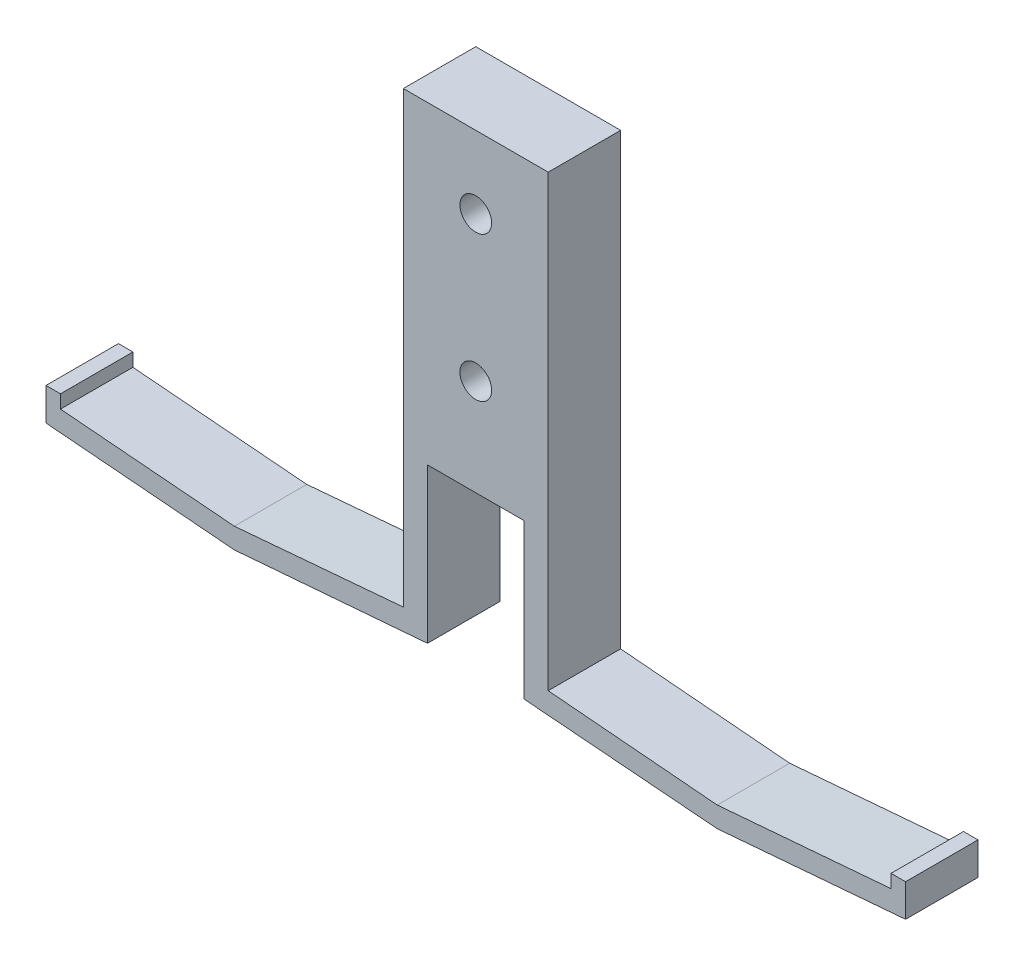
ISO-10303-21;
HEADER;
FILE_DESCRIPTION(('STEP AP214'),'2;1');
FILE_NAME('part.step','',(''),(''),'','','');
FILE_SCHEMA(('AUTOMOTIVE_DESIGN { 1 0 10303 214 1 1 1 1 }'));
ENDSEC;
DATA;
#1=APPLICATION_CONTEXT('core data for automotive mechanical design processes');
#2=APPLICATION_PROTOCOL_DEFINITION('international standard','automotive_design',2000,#1);
#3=PRODUCT_CONTEXT('',#1,'mechanical');
#4=PRODUCT('Part','Part','',(#3));
#5=PRODUCT_RELATED_PRODUCT_CATEGORY('part','',(#4));
#6=PRODUCT_DEFINITION_FORMATION('','',#4);
#7=PRODUCT_DEFINITION_CONTEXT('part definition',#1,'design');
#8=PRODUCT_DEFINITION('design','',#6,#7);
#9=PRODUCT_DEFINITION_SHAPE('','',#8);
#10=(LENGTH_UNIT() NAMED_UNIT(*) SI_UNIT(.MILLI.,.METRE.));
#11=(NAMED_UNIT(*) PLANE_ANGLE_UNIT() SI_UNIT($,.RADIAN.));
#12=(NAMED_UNIT(*) SI_UNIT($,.STERADIAN.) SOLID_ANGLE_UNIT());
#13=UNCERTAINTY_MEASURE_WITH_UNIT(LENGTH_MEASURE(1.E-05),#10,'distance_accuracy_value','');
#14=(GEOMETRIC_REPRESENTATION_CONTEXT(3) GLOBAL_UNCERTAINTY_ASSIGNED_CONTEXT((#13)) GLOBAL_UNIT_ASSIGNED_CONTEXT((#10,
#11,#12)) REPRESENTATION_CONTEXT('',''));
#15=CARTESIAN_POINT('',(0.,0.,0.));
#16=DIRECTION('',(0.,0.,1.));
#17=DIRECTION('',(1.,0.,0.));
#18=AXIS2_PLACEMENT_3D('',#15,#16,#17);
#19=CARTESIAN_POINT('',(-2.88683144246353,-33.6797001620745,19.05));
#20=DIRECTION('',(0.0854011413464357,0.996346649041751,0.));
#21=DIRECTION('',(-0.996346649041751,0.0854011413464357,0.));
#22=AXIS2_PLACEMENT_3D('',#19,#20,#21);
#23=PLANE('',#22);
#24=DIRECTION('',(0.996346649041751,-0.0854011413464357,0.));
#25=VECTOR('',#24,1.);
#26=CARTESIAN_POINT('',(-2.88683144246353,-33.6797001620745,0.));
#27=LINE('',#26,#25);
#28=CARTESIAN_POINT('',(19.05,-35.56,0.));
#29=VERTEX_POINT('',#28);
#30=CARTESIAN_POINT('',(63.5,-39.37,0.));
#31=VERTEX_POINT('',#30);
#32=EDGE_CURVE('E210',#29,#31,#27,.T.);
#33=ORIENTED_EDGE('',*,*,#32,.F.);
#34=DIRECTION('',(0.,0.,-1.));
#35=VECTOR('',#34,1.);
#36=CARTESIAN_POINT('',(19.05,-35.56,19.05));
#37=LINE('',#36,#35);
#38=CARTESIAN_POINT('',(19.05,-35.56,19.05));
#39=VERTEX_POINT('',#38);
#40=EDGE_CURVE('E11',#39,#29,#37,.T.);
#41=ORIENTED_EDGE('',*,*,#40,.F.);
#42=DIRECTION('',(0.996346649041751,-0.0854011413464357,0.));
#43=VECTOR('',#42,1.);
#44=CARTESIAN_POINT('',(-2.88683144246353,-33.6797001620745,19.05));
#45=LINE('',#44,#43);
#46=CARTESIAN_POINT('',(63.5,-39.37,19.05));
#47=VERTEX_POINT('',#46);
#48=EDGE_CURVE('E280',#39,#47,#45,.T.);
#49=ORIENTED_EDGE('',*,*,#48,.T.);
#50=DIRECTION('',(0.,0.,-1.));
#51=VECTOR('',#50,1.);
#52=CARTESIAN_POINT('',(63.5,-39.37,19.05));
#53=LINE('',#52,#51);
#54=EDGE_CURVE('E129',#47,#31,#53,.T.);
#55=ORIENTED_EDGE('',*,*,#54,.T.);
#56=EDGE_LOOP('',(#33,#41,#49,#55));
#57=FACE_BOUND('',#56,.T.);
#58=ADVANCED_FACE('F41',(#57),#23,.T.);
#59=CARTESIAN_POINT('',(19.05,0.,19.05));
#60=DIRECTION('',(1.,0.,0.));
#61=DIRECTION('',(0.,1.,0.));
#62=AXIS2_PLACEMENT_3D('',#59,#60,#61);
#63=PLANE('',#62);
#64=DIRECTION('',(0.,-1.,0.));
#65=VECTOR('',#64,1.);
#66=CARTESIAN_POINT('',(19.05,0.,0.));
#67=LINE('',#66,#65);
#68=CARTESIAN_POINT('',(19.05,82.55,0.));
#69=VERTEX_POINT('',#68);
#70=EDGE_CURVE('E214',#69,#29,#67,.T.);
#71=ORIENTED_EDGE('',*,*,#70,.F.);
#72=DIRECTION('',(0.,0.,-1.));
#73=VECTOR('',#72,1.);
#74=CARTESIAN_POINT('',(19.05,82.55,19.05));
#75=LINE('',#74,#73);
#76=CARTESIAN_POINT('',(19.05,82.55,19.05));
#77=VERTEX_POINT('',#76);
#78=EDGE_CURVE('E50',#77,#69,#75,.T.);
#79=ORIENTED_EDGE('',*,*,#78,.F.);
#80=DIRECTION('',(0.,-1.,0.));
#81=VECTOR('',#80,1.);
#82=CARTESIAN_POINT('',(19.05,0.,19.05));
#83=LINE('',#82,#81);
#84=EDGE_CURVE('E349',#77,#39,#83,.T.);
#85=ORIENTED_EDGE('',*,*,#84,.T.);
#86=ORIENTED_EDGE('',*,*,#40,.T.);
#87=EDGE_LOOP('',(#71,#79,#85,#86));
#88=FACE_BOUND('',#87,.T.);
#89=ADVANCED_FACE('F348',(#88),#63,.T.);
#90=CARTESIAN_POINT('',(0.,82.55,19.05));
#91=DIRECTION('',(0.,-1.,0.));
#92=DIRECTION('',(0.,0.,-1.));
#93=AXIS2_PLACEMENT_3D('',#90,#91,#92);
#94=PLANE('',#93);
#95=DIRECTION('',(-1.,0.,0.));
#96=VECTOR('',#95,1.);
#97=CARTESIAN_POINT('',(0.,82.55,0.));
#98=LINE('',#97,#96);
#99=CARTESIAN_POINT('',(-19.05,82.55,0.));
#100=VERTEX_POINT('',#99);
#101=EDGE_CURVE('E219',#69,#100,#98,.T.);
#102=ORIENTED_EDGE('',*,*,#101,.T.);
#103=DIRECTION('',(0.,0.,-1.));
#104=VECTOR('',#103,1.);
#105=CARTESIAN_POINT('',(-19.05,82.55,19.05));
#106=LINE('',#105,#104);
#107=CARTESIAN_POINT('',(-19.05,82.55,19.05));
#108=VERTEX_POINT('',#107);
#109=EDGE_CURVE('E330',#108,#100,#106,.T.);
#110=ORIENTED_EDGE('',*,*,#109,.F.);
#111=DIRECTION('',(-1.,0.,0.));
#112=VECTOR('',#111,1.);
#113=CARTESIAN_POINT('',(0.,82.55,19.05));
#114=LINE('',#113,#112);
#115=EDGE_CURVE('E339',#77,#108,#114,.T.);
#116=ORIENTED_EDGE('',*,*,#115,.F.);
#117=ORIENTED_EDGE('',*,*,#78,.T.);
#118=EDGE_LOOP('',(#102,#110,#116,#117));
#119=FACE_BOUND('',#118,.T.);
#120=ADVANCED_FACE('F337',(#119),#94,.F.);
#121=CARTESIAN_POINT('',(-19.05,0.,19.05));
#122=DIRECTION('',(1.,0.,0.));
#123=DIRECTION('',(0.,1.,0.));
#124=AXIS2_PLACEMENT_3D('',#121,#122,#123);
#125=PLANE('',#124);
#126=DIRECTION('',(0.,-1.,0.));
#127=VECTOR('',#126,1.);
#128=CARTESIAN_POINT('',(-19.05,0.,0.));
#129=LINE('',#128,#127);
#130=CARTESIAN_POINT('',(-19.05,-35.56,0.));
#131=VERTEX_POINT('',#130);
#132=EDGE_CURVE('E222',#100,#131,#129,.T.);
#133=ORIENTED_EDGE('',*,*,#132,.T.);
#134=DIRECTION('',(0.,0.,-1.));
#135=VECTOR('',#134,1.);
#136=CARTESIAN_POINT('',(-19.05,-35.56,19.05));
#137=LINE('',#136,#135);
#138=CARTESIAN_POINT('',(-19.05,-35.56,19.05));
#139=VERTEX_POINT('',#138);
#140=EDGE_CURVE('E326',#139,#131,#137,.T.);
#141=ORIENTED_EDGE('',*,*,#140,.F.);
#142=DIRECTION('',(0.,-1.,0.));
#143=VECTOR('',#142,1.);
#144=CARTESIAN_POINT('',(-19.05,0.,19.05));
#145=LINE('',#144,#143);
#146=EDGE_CURVE('E362',#108,#139,#145,.T.);
#147=ORIENTED_EDGE('',*,*,#146,.F.);
#148=ORIENTED_EDGE('',*,*,#109,.T.);
#149=EDGE_LOOP('',(#133,#141,#147,#148));
#150=FACE_BOUND('',#149,.T.);
#151=ADVANCED_FACE('F466',(#150),#125,.F.);
#152=CARTESIAN_POINT('',(2.88683144246353,-33.6797001620746,19.05));
#153=DIRECTION('',(0.0854011413464358,-0.996346649041751,0.));
#154=DIRECTION('',(0.996346649041751,0.0854011413464358,0.));
#155=AXIS2_PLACEMENT_3D('',#152,#153,#154);
#156=PLANE('',#155);
#157=DIRECTION('',(-0.996346649041751,-0.0854011413464358,0.));
#158=VECTOR('',#157,1.);
#159=CARTESIAN_POINT('',(2.88683144246353,-33.6797001620746,0.));
#160=LINE('',#159,#158);
#161=CARTESIAN_POINT('',(-63.5,-39.37,0.));
#162=VERTEX_POINT('',#161);
#163=EDGE_CURVE('E225',#131,#162,#160,.T.);
#164=ORIENTED_EDGE('',*,*,#163,.T.);
#165=DIRECTION('',(0.,0.,-1.));
#166=VECTOR('',#165,1.);
#167=CARTESIAN_POINT('',(-63.5,-39.37,19.05));
#168=LINE('',#167,#166);
#169=CARTESIAN_POINT('',(-63.5,-39.37,19.05));
#170=VERTEX_POINT('',#169);
#171=EDGE_CURVE('E323',#170,#162,#168,.T.);
#172=ORIENTED_EDGE('',*,*,#171,.F.);
#173=DIRECTION('',(-0.996346649041751,-0.0854011413464358,0.));
#174=VECTOR('',#173,1.);
#175=CARTESIAN_POINT('',(2.88683144246353,-33.6797001620746,19.05));
#176=LINE('',#175,#174);
#177=EDGE_CURVE('E365',#139,#170,#176,.T.);
#178=ORIENTED_EDGE('',*,*,#177,.F.);
#179=ORIENTED_EDGE('',*,*,#140,.T.);
#180=EDGE_LOOP('',(#164,#172,#178,#179));
#181=FACE_BOUND('',#180,.T.);
#182=ADVANCED_FACE('F462',(#181),#156,.F.);
#183=CARTESIAN_POINT('',(-3.69613793103445,-44.3536551724138,19.05));
#184=DIRECTION('',(0.0830454798537394,0.99654575824488,0.));
#185=DIRECTION('',(-0.99654575824488,0.0830454798537394,0.));
#186=AXIS2_PLACEMENT_3D('',#183,#184,#185);
#187=PLANE('',#186);
#188=DIRECTION('',(0.99654575824488,-0.0830454798537394,0.));
#189=VECTOR('',#188,1.);
#190=CARTESIAN_POINT('',(-3.69613793103445,-44.3536551724138,0.));
#191=LINE('',#190,#189);
#192=CARTESIAN_POINT('',(-109.22,-35.56,0.));
#193=VERTEX_POINT('',#192);
#194=EDGE_CURVE('E229',#193,#162,#191,.T.);
#195=ORIENTED_EDGE('',*,*,#194,.F.);
#196=DIRECTION('',(0.,0.,-1.));
#197=VECTOR('',#196,1.);
#198=CARTESIAN_POINT('',(-109.22,-35.56,19.05));
#199=LINE('',#198,#197);
#200=CARTESIAN_POINT('',(-109.22,-35.56,19.05));
#201=VERTEX_POINT('',#200);
#202=EDGE_CURVE('E320',#201,#193,#199,.T.);
#203=ORIENTED_EDGE('',*,*,#202,.F.);
#204=DIRECTION('',(0.99654575824488,-0.0830454798537394,0.));
#205=VECTOR('',#204,1.);
#206=CARTESIAN_POINT('',(-3.69613793103445,-44.3536551724138,19.05));
#207=LINE('',#206,#205);
#208=EDGE_CURVE('E368',#201,#170,#207,.T.);
#209=ORIENTED_EDGE('',*,*,#208,.T.);
#210=ORIENTED_EDGE('',*,*,#171,.T.);
#211=EDGE_LOOP('',(#195,#203,#209,#210));
#212=FACE_BOUND('',#211,.T.);
#213=ADVANCED_FACE('F457',(#212),#187,.T.);
#214=CARTESIAN_POINT('',(-109.22,0.,19.05));
#215=DIRECTION('',(1.,0.,0.));
#216=DIRECTION('',(0.,0.,-1.));
#217=AXIS2_PLACEMENT_3D('',#214,#215,#216);
#218=PLANE('',#217);
#219=DIRECTION('',(0.,-1.,0.));
#220=VECTOR('',#219,1.);
#221=CARTESIAN_POINT('',(-109.22,0.,0.));
#222=LINE('',#221,#220);
#223=CARTESIAN_POINT('',(-109.22,-32.0675,0.));
#224=VERTEX_POINT('',#223);
#225=EDGE_CURVE('E233',#224,#193,#222,.T.);
#226=ORIENTED_EDGE('',*,*,#225,.F.);
#227=DIRECTION('',(0.,0.,-1.));
#228=VECTOR('',#227,1.);
#229=CARTESIAN_POINT('',(-109.22,-32.0675,19.05));
#230=LINE('',#229,#228);
#231=CARTESIAN_POINT('',(-109.22,-32.0675,19.05));
#232=VERTEX_POINT('',#231);
#233=EDGE_CURVE('E317',#232,#224,#230,.T.);
#234=ORIENTED_EDGE('',*,*,#233,.F.);
#235=DIRECTION('',(0.,-1.,0.));
#236=VECTOR('',#235,1.);
#237=CARTESIAN_POINT('',(-109.22,0.,19.05));
#238=LINE('',#237,#236);
#239=EDGE_CURVE('E372',#232,#201,#238,.T.);
#240=ORIENTED_EDGE('',*,*,#239,.T.);
#241=ORIENTED_EDGE('',*,*,#202,.T.);
#242=EDGE_LOOP('',(#226,#234,#240,#241));
#243=FACE_BOUND('',#242,.T.);
#244=ADVANCED_FACE('F454',(#243),#218,.T.);
#245=CARTESIAN_POINT('',(0.,-32.0675,19.05));
#246=DIRECTION('',(0.,1.,0.));
#247=DIRECTION('',(0.,0.,1.));
#248=AXIS2_PLACEMENT_3D('',#245,#246,#247);
#249=PLANE('',#248);
#250=DIRECTION('',(1.,0.,0.));
#251=VECTOR('',#250,1.);
#252=CARTESIAN_POINT('',(0.,-32.0675,0.));
#253=LINE('',#252,#251);
#254=CARTESIAN_POINT('',(-113.03,-32.0675,0.));
#255=VERTEX_POINT('',#254);
#256=EDGE_CURVE('E237',#255,#224,#253,.T.);
#257=ORIENTED_EDGE('',*,*,#256,.F.);
#258=DIRECTION('',(0.,0.,-1.));
#259=VECTOR('',#258,1.);
#260=CARTESIAN_POINT('',(-113.03,-32.0675,19.05));
#261=LINE('',#260,#259);
#262=CARTESIAN_POINT('',(-113.03,-32.0675,19.05));
#263=VERTEX_POINT('',#262);
#264=EDGE_CURVE('E314',#263,#255,#261,.T.);
#265=ORIENTED_EDGE('',*,*,#264,.F.);
#266=DIRECTION('',(1.,0.,0.));
#267=VECTOR('',#266,1.);
#268=CARTESIAN_POINT('',(0.,-32.0675,19.05));
#269=LINE('',#268,#267);
#270=EDGE_CURVE('E376',#263,#232,#269,.T.);
#271=ORIENTED_EDGE('',*,*,#270,.T.);
#272=ORIENTED_EDGE('',*,*,#233,.T.);
#273=EDGE_LOOP('',(#257,#265,#271,#272));
#274=FACE_BOUND('',#273,.T.);
#275=ADVANCED_FACE('F450',(#274),#249,.T.);
#276=CARTESIAN_POINT('',(-113.03,0.,19.05));
#277=DIRECTION('',(-1.,0.,0.));
#278=DIRECTION('',(0.,0.,1.));
#279=AXIS2_PLACEMENT_3D('',#276,#277,#278);
#280=PLANE('',#279);
#281=DIRECTION('',(0.,1.,0.));
#282=VECTOR('',#281,1.);
#283=CARTESIAN_POINT('',(-113.03,0.,0.));
#284=LINE('',#283,#282);
#285=CARTESIAN_POINT('',(-113.03,-40.64,0.));
#286=VERTEX_POINT('',#285);
#287=EDGE_CURVE('E241',#286,#255,#284,.T.);
#288=ORIENTED_EDGE('',*,*,#287,.F.);
#289=DIRECTION('',(0.,0.,-1.));
#290=VECTOR('',#289,1.);
#291=CARTESIAN_POINT('',(-113.03,-40.64,19.05));
#292=LINE('',#291,#290);
#293=CARTESIAN_POINT('',(-113.03,-40.64,19.05));
#294=VERTEX_POINT('',#293);
#295=EDGE_CURVE('E311',#294,#286,#292,.T.);
#296=ORIENTED_EDGE('',*,*,#295,.F.);
#297=DIRECTION('',(0.,1.,0.));
#298=VECTOR('',#297,1.);
#299=CARTESIAN_POINT('',(-113.03,0.,19.05));
#300=LINE('',#299,#298);
#301=EDGE_CURVE('E380',#294,#263,#300,.T.);
#302=ORIENTED_EDGE('',*,*,#301,.T.);
#303=ORIENTED_EDGE('',*,*,#264,.T.);
#304=EDGE_LOOP('',(#288,#296,#302,#303));
#305=FACE_BOUND('',#304,.T.);
#306=ADVANCED_FACE('F446',(#305),#280,.T.);
#307=CARTESIAN_POINT('',(-4.14282758620687,-49.7139310344827,19.05));
#308=DIRECTION('',(-0.0830454798537396,-0.99654575824488,0.));
#309=DIRECTION('',(0.99654575824488,-0.0830454798537396,0.));
#310=AXIS2_PLACEMENT_3D('',#307,#308,#309);
#311=PLANE('',#310);
#312=DIRECTION('',(-0.99654575824488,0.0830454798537396,0.));
#313=VECTOR('',#312,1.);
#314=CARTESIAN_POINT('',(-4.14282758620687,-49.7139310344827,0.));
#315=LINE('',#314,#313);
#316=CARTESIAN_POINT('',(-63.5,-44.7675,0.));
#317=VERTEX_POINT('',#316);
#318=EDGE_CURVE('E245',#317,#286,#315,.T.);
#319=ORIENTED_EDGE('',*,*,#318,.F.);
#320=DIRECTION('',(0.,0.,-1.));
#321=VECTOR('',#320,1.);
#322=CARTESIAN_POINT('',(-63.5,-44.7675,19.05));
#323=LINE('',#322,#321);
#324=CARTESIAN_POINT('',(-63.5,-44.7675,19.05));
#325=VERTEX_POINT('',#324);
#326=EDGE_CURVE('E308',#325,#317,#323,.T.);
#327=ORIENTED_EDGE('',*,*,#326,.F.);
#328=DIRECTION('',(-0.99654575824488,0.0830454798537396,0.));
#329=VECTOR('',#328,1.);
#330=CARTESIAN_POINT('',(-4.14282758620687,-49.7139310344827,19.05));
#331=LINE('',#330,#329);
#332=EDGE_CURVE('E384',#325,#294,#331,.T.);
#333=ORIENTED_EDGE('',*,*,#332,.T.);
#334=ORIENTED_EDGE('',*,*,#295,.T.);
#335=EDGE_LOOP('',(#319,#327,#333,#334));
#336=FACE_BOUND('',#335,.T.);
#337=ADVANCED_FACE('F442',(#336),#311,.T.);
#338=CARTESIAN_POINT('',(3.19705460048895,-39.3483643137103,19.05));
#339=DIRECTION('',(0.0809831321077374,-0.996715472095232,0.));
#340=DIRECTION('',(0.996715472095232,0.0809831321077374,0.));
#341=AXIS2_PLACEMENT_3D('',#338,#339,#340);
#342=PLANE('',#341);
#343=DIRECTION('',(-0.996715472095232,-0.0809831321077374,0.));
#344=VECTOR('',#343,1.);
#345=CARTESIAN_POINT('',(3.19705460048895,-39.3483643137103,0.));
#346=LINE('',#345,#344);
#347=CARTESIAN_POINT('',(-12.7,-40.64,0.));
#348=VERTEX_POINT('',#347);
#349=EDGE_CURVE('E249',#348,#317,#346,.T.);
#350=ORIENTED_EDGE('',*,*,#349,.F.);
#351=DIRECTION('',(0.,0.,-1.));
#352=VECTOR('',#351,1.);
#353=CARTESIAN_POINT('',(-12.7,-40.64,19.05));
#354=LINE('',#353,#352);
#355=CARTESIAN_POINT('',(-12.7,-40.64,19.05));
#356=VERTEX_POINT('',#355);
#357=EDGE_CURVE('E305',#356,#348,#354,.T.);
#358=ORIENTED_EDGE('',*,*,#357,.F.);
#359=DIRECTION('',(-0.996715472095232,-0.0809831321077374,0.));
#360=VECTOR('',#359,1.);
#361=CARTESIAN_POINT('',(3.19705460048895,-39.3483643137103,19.05));
#362=LINE('',#361,#360);
#363=EDGE_CURVE('E388',#356,#325,#362,.T.);
#364=ORIENTED_EDGE('',*,*,#363,.T.);
#365=ORIENTED_EDGE('',*,*,#326,.T.);
#366=EDGE_LOOP('',(#350,#358,#364,#365));
#367=FACE_BOUND('',#366,.T.);
#368=ADVANCED_FACE('F438',(#367),#342,.T.);
#369=CARTESIAN_POINT('',(-12.7,0.,19.05));
#370=DIRECTION('',(1.,0.,0.));
#371=DIRECTION('',(0.,1.,0.));
#372=AXIS2_PLACEMENT_3D('',#369,#370,#371);
#373=PLANE('',#372);
#374=DIRECTION('',(0.,-1.,0.));
#375=VECTOR('',#374,1.);
#376=CARTESIAN_POINT('',(-12.7,0.,0.));
#377=LINE('',#376,#375);
#378=CARTESIAN_POINT('',(-12.7,0.,0.));
#379=VERTEX_POINT('',#378);
#380=EDGE_CURVE('E253',#379,#348,#377,.T.);
#381=ORIENTED_EDGE('',*,*,#380,.F.);
#382=DIRECTION('',(0.,0.,-1.));
#383=VECTOR('',#382,1.);
#384=CARTESIAN_POINT('',(-12.7,0.,19.05));
#385=LINE('',#384,#383);
#386=CARTESIAN_POINT('',(-12.7,0.,19.05));
#387=VERTEX_POINT('',#386);
#388=EDGE_CURVE('E302',#387,#379,#385,.T.);
#389=ORIENTED_EDGE('',*,*,#388,.F.);
#390=DIRECTION('',(0.,-1.,0.));
#391=VECTOR('',#390,1.);
#392=CARTESIAN_POINT('',(-12.7,0.,19.05));
#393=LINE('',#392,#391);
#394=EDGE_CURVE('E392',#387,#356,#393,.T.);
#395=ORIENTED_EDGE('',*,*,#394,.T.);
#396=ORIENTED_EDGE('',*,*,#357,.T.);
#397=EDGE_LOOP('',(#381,#389,#395,#396));
#398=FACE_BOUND('',#397,.T.);
#399=ADVANCED_FACE('F434',(#398),#373,.T.);
#400=CARTESIAN_POINT('',(0.,0.,19.05));
#401=DIRECTION('',(0.,-1.,0.));
#402=DIRECTION('',(0.,0.,-1.));
#403=AXIS2_PLACEMENT_3D('',#400,#401,#402);
#404=PLANE('',#403);
#405=DIRECTION('',(-1.,0.,0.));
#406=VECTOR('',#405,1.);
#407=CARTESIAN_POINT('',(0.,0.,0.));
#408=LINE('',#407,#406);
#409=CARTESIAN_POINT('',(12.7,0.,0.));
#410=VERTEX_POINT('',#409);
#411=EDGE_CURVE('E257',#410,#379,#408,.T.);
#412=ORIENTED_EDGE('',*,*,#411,.F.);
#413=DIRECTION('',(0.,0.,-1.));
#414=VECTOR('',#413,1.);
#415=CARTESIAN_POINT('',(12.7,0.,19.05));
#416=LINE('',#415,#414);
#417=CARTESIAN_POINT('',(12.7,0.,19.05));
#418=VERTEX_POINT('',#417);
#419=EDGE_CURVE('E299',#418,#410,#416,.T.);
#420=ORIENTED_EDGE('',*,*,#419,.F.);
#421=DIRECTION('',(-1.,0.,0.));
#422=VECTOR('',#421,1.);
#423=CARTESIAN_POINT('',(0.,0.,19.05));
#424=LINE('',#423,#422);
#425=EDGE_CURVE('E396',#418,#387,#424,.T.);
#426=ORIENTED_EDGE('',*,*,#425,.T.);
#427=ORIENTED_EDGE('',*,*,#388,.T.);
#428=EDGE_LOOP('',(#412,#420,#426,#427));
#429=FACE_BOUND('',#428,.T.);
#430=ADVANCED_FACE('F430',(#429),#404,.T.);
#431=CARTESIAN_POINT('',(12.7,0.,19.05));
#432=DIRECTION('',(1.,0.,0.));
#433=DIRECTION('',(0.,1.,0.));
#434=AXIS2_PLACEMENT_3D('',#431,#432,#433);
#435=PLANE('',#434);
#436=DIRECTION('',(0.,-1.,0.));
#437=VECTOR('',#436,1.);
#438=CARTESIAN_POINT('',(12.7,0.,0.));
#439=LINE('',#438,#437);
#440=CARTESIAN_POINT('',(12.7,-40.64,0.));
#441=VERTEX_POINT('',#440);
#442=EDGE_CURVE('E261',#410,#441,#439,.T.);
#443=ORIENTED_EDGE('',*,*,#442,.T.);
#444=DIRECTION('',(0.,0.,-1.));
#445=VECTOR('',#444,1.);
#446=CARTESIAN_POINT('',(12.7,-40.64,19.05));
#447=LINE('',#446,#445);
#448=CARTESIAN_POINT('',(12.7,-40.64,19.05));
#449=VERTEX_POINT('',#448);
#450=EDGE_CURVE('E295',#449,#441,#447,.T.);
#451=ORIENTED_EDGE('',*,*,#450,.F.);
#452=DIRECTION('',(0.,-1.,0.));
#453=VECTOR('',#452,1.);
#454=CARTESIAN_POINT('',(12.7,0.,19.05));
#455=LINE('',#454,#453);
#456=EDGE_CURVE('E400',#418,#449,#455,.T.);
#457=ORIENTED_EDGE('',*,*,#456,.F.);
#458=ORIENTED_EDGE('',*,*,#419,.T.);
#459=EDGE_LOOP('',(#443,#451,#457,#458));
#460=FACE_BOUND('',#459,.T.);
#461=ADVANCED_FACE('F427',(#460),#435,.F.);
#462=CARTESIAN_POINT('',(-3.19705460048894,-39.3483643137103,19.05));
#463=DIRECTION('',(0.0809831321077371,0.996715472095232,0.));
#464=DIRECTION('',(-0.996715472095232,0.0809831321077371,0.));
#465=AXIS2_PLACEMENT_3D('',#462,#463,#464);
#466=PLANE('',#465);
#467=DIRECTION('',(0.996715472095232,-0.0809831321077372,0.));
#468=VECTOR('',#467,1.);
#469=CARTESIAN_POINT('',(-3.19705460048894,-39.3483643137103,0.));
#470=LINE('',#469,#468);
#471=CARTESIAN_POINT('',(63.5,-44.7675,0.));
#472=VERTEX_POINT('',#471);
#473=EDGE_CURVE('E264',#441,#472,#470,.T.);
#474=ORIENTED_EDGE('',*,*,#473,.T.);
#475=DIRECTION('',(0.,0.,-1.));
#476=VECTOR('',#475,1.);
#477=CARTESIAN_POINT('',(63.5,-44.7675,19.05));
#478=LINE('',#477,#476);
#479=CARTESIAN_POINT('',(63.5,-44.7675,19.05));
#480=VERTEX_POINT('',#479);
#481=EDGE_CURVE('E291',#480,#472,#478,.T.);
#482=ORIENTED_EDGE('',*,*,#481,.F.);
#483=DIRECTION('',(0.996715472095232,-0.0809831321077372,0.));
#484=VECTOR('',#483,1.);
#485=CARTESIAN_POINT('',(-3.19705460048894,-39.3483643137103,19.05));
#486=LINE('',#485,#484);
#487=EDGE_CURVE('E403',#449,#480,#486,.T.);
#488=ORIENTED_EDGE('',*,*,#487,.F.);
#489=ORIENTED_EDGE('',*,*,#450,.T.);
#490=EDGE_LOOP('',(#474,#482,#488,#489));
#491=FACE_BOUND('',#490,.T.);
#492=ADVANCED_FACE('F423',(#491),#466,.F.);
#493=CARTESIAN_POINT('',(4.14282758620689,-49.7139310344827,19.05));
#494=DIRECTION('',(-0.0830454798537398,0.99654575824488,0.));
#495=DIRECTION('',(-0.99654575824488,-0.0830454798537398,0.));
#496=AXIS2_PLACEMENT_3D('',#493,#494,#495);
#497=PLANE('',#496);
#498=DIRECTION('',(0.99654575824488,0.0830454798537398,0.));
#499=VECTOR('',#498,1.);
#500=CARTESIAN_POINT('',(4.14282758620689,-49.7139310344827,0.));
#501=LINE('',#500,#499);
#502=CARTESIAN_POINT('',(113.03,-40.64,0.));
#503=VERTEX_POINT('',#502);
#504=EDGE_CURVE('E267',#472,#503,#501,.T.);
#505=ORIENTED_EDGE('',*,*,#504,.T.);
#506=DIRECTION('',(0.,0.,-1.));
#507=VECTOR('',#506,1.);
#508=CARTESIAN_POINT('',(113.03,-40.64,19.05));
#509=LINE('',#508,#507);
#510=CARTESIAN_POINT('',(113.03,-40.64,19.05));
#511=VERTEX_POINT('',#510);
#512=EDGE_CURVE('E287',#511,#503,#509,.T.);
#513=ORIENTED_EDGE('',*,*,#512,.F.);
#514=DIRECTION('',(0.99654575824488,0.0830454798537398,0.));
#515=VECTOR('',#514,1.);
#516=CARTESIAN_POINT('',(4.14282758620689,-49.7139310344827,19.05));
#517=LINE('',#516,#515);
#518=EDGE_CURVE('E406',#480,#511,#517,.T.);
#519=ORIENTED_EDGE('',*,*,#518,.F.);
#520=ORIENTED_EDGE('',*,*,#481,.T.);
#521=EDGE_LOOP('',(#505,#513,#519,#520));
#522=FACE_BOUND('',#521,.T.);
#523=ADVANCED_FACE('F414',(#522),#497,.F.);
#524=CARTESIAN_POINT('',(113.03,0.,19.05));
#525=DIRECTION('',(-1.,0.,0.));
#526=DIRECTION('',(0.,0.,1.));
#527=AXIS2_PLACEMENT_3D('',#524,#525,#526);
#528=PLANE('',#527);
#529=DIRECTION('',(0.,1.,0.));
#530=VECTOR('',#529,1.);
#531=CARTESIAN_POINT('',(113.03,0.,0.));
#532=LINE('',#531,#530);
#533=CARTESIAN_POINT('',(113.03,-32.0675,0.));
#534=VERTEX_POINT('',#533);
#535=EDGE_CURVE('E270',#503,#534,#532,.T.);
#536=ORIENTED_EDGE('',*,*,#535,.T.);
#537=DIRECTION('',(0.,0.,-1.));
#538=VECTOR('',#537,1.);
#539=CARTESIAN_POINT('',(113.03,-32.0675,19.05));
#540=LINE('',#539,#538);
#541=CARTESIAN_POINT('',(113.03,-32.0675,19.05));
#542=VERTEX_POINT('',#541);
#543=EDGE_CURVE('E200',#542,#534,#540,.T.);
#544=ORIENTED_EDGE('',*,*,#543,.F.);
#545=DIRECTION('',(0.,1.,0.));
#546=VECTOR('',#545,1.);
#547=CARTESIAN_POINT('',(113.03,0.,19.05));
#548=LINE('',#547,#546);
#549=EDGE_CURVE('E189',#511,#542,#548,.T.);
#550=ORIENTED_EDGE('',*,*,#549,.F.);
#551=ORIENTED_EDGE('',*,*,#512,.T.);
#552=EDGE_LOOP('',(#536,#544,#550,#551));
#553=FACE_BOUND('',#552,.T.);
#554=ADVANCED_FACE('F418',(#553),#528,.F.);
#555=CARTESIAN_POINT('',(0.,-32.0675,19.05));
#556=DIRECTION('',(0.,-1.,0.));
#557=DIRECTION('',(0.,0.,-1.));
#558=AXIS2_PLACEMENT_3D('',#555,#556,#557);
#559=PLANE('',#558);
#560=DIRECTION('',(-1.,0.,0.));
#561=VECTOR('',#560,1.);
#562=CARTESIAN_POINT('',(0.,-32.0675,0.));
#563=LINE('',#562,#561);
#564=CARTESIAN_POINT('',(109.22,-32.0675,0.));
#565=VERTEX_POINT('',#564);
#566=EDGE_CURVE('E198',#534,#565,#563,.T.);
#567=ORIENTED_EDGE('',*,*,#566,.T.);
#568=DIRECTION('',(0.,0.,-1.));
#569=VECTOR('',#568,1.);
#570=CARTESIAN_POINT('',(109.22,-32.0675,19.05));
#571=LINE('',#570,#569);
#572=CARTESIAN_POINT('',(109.22,-32.0675,19.05));
#573=VERTEX_POINT('',#572);
#574=EDGE_CURVE('E195',#573,#565,#571,.T.);
#575=ORIENTED_EDGE('',*,*,#574,.F.);
#576=DIRECTION('',(-1.,0.,0.));
#577=VECTOR('',#576,1.);
#578=CARTESIAN_POINT('',(0.,-32.0675,19.05));
#579=LINE('',#578,#577);
#580=EDGE_CURVE('E183',#542,#573,#579,.T.);
#581=ORIENTED_EDGE('',*,*,#580,.F.);
#582=ORIENTED_EDGE('',*,*,#543,.T.);
#583=EDGE_LOOP('',(#567,#575,#581,#582));
#584=FACE_BOUND('',#583,.T.);
#585=ADVANCED_FACE('F196',(#584),#559,.F.);
#586=CARTESIAN_POINT('',(109.22,0.,19.05));
#587=DIRECTION('',(1.,0.,0.));
#588=DIRECTION('',(0.,0.,-1.));
#589=AXIS2_PLACEMENT_3D('',#586,#587,#588);
#590=PLANE('',#589);
#591=DIRECTION('',(0.,-1.,0.));
#592=VECTOR('',#591,1.);
#593=CARTESIAN_POINT('',(109.22,0.,0.));
#594=LINE('',#593,#592);
#595=CARTESIAN_POINT('',(109.22,-35.56,0.));
#596=VERTEX_POINT('',#595);
#597=EDGE_CURVE('E122',#565,#596,#594,.T.);
#598=ORIENTED_EDGE('',*,*,#597,.T.);
#599=DIRECTION('',(0.,0.,-1.));
#600=VECTOR('',#599,1.);
#601=CARTESIAN_POINT('',(109.22,-35.56,19.05));
#602=LINE('',#601,#600);
#603=CARTESIAN_POINT('',(109.22,-35.56,19.05));
#604=VERTEX_POINT('',#603);
#605=EDGE_CURVE('E201',#604,#596,#602,.T.);
#606=ORIENTED_EDGE('',*,*,#605,.F.);
#607=DIRECTION('',(0.,-1.,0.));
#608=VECTOR('',#607,1.);
#609=CARTESIAN_POINT('',(109.22,0.,19.05));
#610=LINE('',#609,#608);
#611=EDGE_CURVE('E187',#573,#604,#610,.T.);
#612=ORIENTED_EDGE('',*,*,#611,.F.);
#613=ORIENTED_EDGE('',*,*,#574,.T.);
#614=EDGE_LOOP('',(#598,#606,#612,#613));
#615=FACE_BOUND('',#614,.T.);
#616=ADVANCED_FACE('F203',(#615),#590,.F.);
#617=CARTESIAN_POINT('',(3.69613793103447,-44.3536551724138,19.05));
#618=DIRECTION('',(0.0830454798537397,-0.99654575824488,0.));
#619=DIRECTION('',(0.99654575824488,0.0830454798537397,0.));
#620=AXIS2_PLACEMENT_3D('',#617,#618,#619);
#621=PLANE('',#620);
#622=DIRECTION('',(-0.99654575824488,-0.0830454798537397,0.));
#623=VECTOR('',#622,1.);
#624=CARTESIAN_POINT('',(3.69613793103447,-44.3536551724138,0.));
#625=LINE('',#624,#623);
#626=EDGE_CURVE('E277',#596,#31,#625,.T.);
#627=ORIENTED_EDGE('',*,*,#626,.T.);
#628=ORIENTED_EDGE('',*,*,#54,.F.);
#629=DIRECTION('',(-0.99654575824488,-0.0830454798537397,0.));
#630=VECTOR('',#629,1.);
#631=CARTESIAN_POINT('',(3.69613793103447,-44.3536551724138,19.05));
#632=LINE('',#631,#630);
#633=EDGE_CURVE('E58',#604,#47,#632,.T.);
#634=ORIENTED_EDGE('',*,*,#633,.F.);
#635=ORIENTED_EDGE('',*,*,#605,.T.);
#636=EDGE_LOOP('',(#627,#628,#634,#635));
#637=FACE_BOUND('',#636,.T.);
#638=ADVANCED_FACE('F352',(#637),#621,.F.);
#639=CARTESIAN_POINT('',(0.,0.,19.05));
#640=DIRECTION('',(0.,0.,1.));
#641=DIRECTION('',(1.,0.,0.));
#642=AXIS2_PLACEMENT_3D('',#639,#640,#641);
#643=PLANE('',#642);
#644=CARTESIAN_POINT('',(0.,25.4,19.05));
#645=DIRECTION('',(0.,0.,1.));
#646=DIRECTION('',(1.,0.,0.));
#647=AXIS2_PLACEMENT_3D('',#644,#645,#646);
#648=CIRCLE('',#647,4.167251);
#649=CARTESIAN_POINT('',(4.167251,25.4,19.05));
#650=VERTEX_POINT('',#649);
#651=EDGE_CURVE('E666',#650,#650,#648,.T.);
#652=ORIENTED_EDGE('',*,*,#651,.F.);
#653=EDGE_LOOP('',(#652));
#654=FACE_BOUND('',#653,.T.);
#655=CARTESIAN_POINT('',(0.,63.5,19.05));
#656=DIRECTION('',(0.,0.,1.));
#657=DIRECTION('',(1.,0.,0.));
#658=AXIS2_PLACEMENT_3D('',#655,#656,#657);
#659=CIRCLE('',#658,4.167251);
#660=CARTESIAN_POINT('',(4.167251,63.5,19.05));
#661=VERTEX_POINT('',#660);
#662=EDGE_CURVE('E670',#661,#661,#659,.T.);
#663=ORIENTED_EDGE('',*,*,#662,.F.);
#664=EDGE_LOOP('',(#663));
#665=FACE_BOUND('',#664,.T.);
#666=ORIENTED_EDGE('',*,*,#48,.F.);
#667=ORIENTED_EDGE('',*,*,#84,.F.);
#668=ORIENTED_EDGE('',*,*,#115,.T.);
#669=ORIENTED_EDGE('',*,*,#146,.T.);
#670=ORIENTED_EDGE('',*,*,#177,.T.);
#671=ORIENTED_EDGE('',*,*,#208,.F.);
#672=ORIENTED_EDGE('',*,*,#239,.F.);
#673=ORIENTED_EDGE('',*,*,#270,.F.);
#674=ORIENTED_EDGE('',*,*,#301,.F.);
#675=ORIENTED_EDGE('',*,*,#332,.F.);
#676=ORIENTED_EDGE('',*,*,#363,.F.);
#677=ORIENTED_EDGE('',*,*,#394,.F.);
#678=ORIENTED_EDGE('',*,*,#425,.F.);
#679=ORIENTED_EDGE('',*,*,#456,.T.);
#680=ORIENTED_EDGE('',*,*,#487,.T.);
#681=ORIENTED_EDGE('',*,*,#518,.T.);
#682=ORIENTED_EDGE('',*,*,#549,.T.);
#683=ORIENTED_EDGE('',*,*,#580,.T.);
#684=ORIENTED_EDGE('',*,*,#611,.T.);
#685=ORIENTED_EDGE('',*,*,#633,.T.);
#686=EDGE_LOOP('',(#666,#667,#668,#669,#670,#671,#672,#673,#674,#675,#676,#677,#678,#679,#680,
#681,#682,#683,#684,#685));
#687=FACE_BOUND('',#686,.T.);
#688=ADVANCED_FACE('F185',(#654,#665,#687),#643,.T.);
#689=CARTESIAN_POINT('',(0.,0.,0.));
#690=DIRECTION('',(0.,0.,1.));
#691=DIRECTION('',(1.,0.,0.));
#692=AXIS2_PLACEMENT_3D('',#689,#690,#691);
#693=PLANE('',#692);
#694=CARTESIAN_POINT('',(0.,25.4,0.));
#695=DIRECTION('',(0.,0.,1.));
#696=DIRECTION('',(1.,0.,0.));
#697=AXIS2_PLACEMENT_3D('',#694,#695,#696);
#698=CIRCLE('',#697,4.16725099999999);
#699=CARTESIAN_POINT('',(4.16725099999999,25.4,0.));
#700=VERTEX_POINT('',#699);
#701=EDGE_CURVE('E663',#700,#700,#698,.T.);
#702=ORIENTED_EDGE('',*,*,#701,.T.);
#703=EDGE_LOOP('',(#702));
#704=FACE_BOUND('',#703,.T.);
#705=CARTESIAN_POINT('',(0.,63.5,0.));
#706=DIRECTION('',(0.,0.,1.));
#707=DIRECTION('',(1.,0.,0.));
#708=AXIS2_PLACEMENT_3D('',#705,#706,#707);
#709=CIRCLE('',#708,4.16725099999999);
#710=CARTESIAN_POINT('',(4.16725099999999,63.5,0.));
#711=VERTEX_POINT('',#710);
#712=EDGE_CURVE('E215',#711,#711,#709,.T.);
#713=ORIENTED_EDGE('',*,*,#712,.T.);
#714=EDGE_LOOP('',(#713));
#715=FACE_BOUND('',#714,.T.);
#716=ORIENTED_EDGE('',*,*,#32,.T.);
#717=ORIENTED_EDGE('',*,*,#626,.F.);
#718=ORIENTED_EDGE('',*,*,#597,.F.);
#719=ORIENTED_EDGE('',*,*,#566,.F.);
#720=ORIENTED_EDGE('',*,*,#535,.F.);
#721=ORIENTED_EDGE('',*,*,#504,.F.);
#722=ORIENTED_EDGE('',*,*,#473,.F.);
#723=ORIENTED_EDGE('',*,*,#442,.F.);
#724=ORIENTED_EDGE('',*,*,#411,.T.);
#725=ORIENTED_EDGE('',*,*,#380,.T.);
#726=ORIENTED_EDGE('',*,*,#349,.T.);
#727=ORIENTED_EDGE('',*,*,#318,.T.);
#728=ORIENTED_EDGE('',*,*,#287,.T.);
#729=ORIENTED_EDGE('',*,*,#256,.T.);
#730=ORIENTED_EDGE('',*,*,#225,.T.);
#731=ORIENTED_EDGE('',*,*,#194,.T.);
#732=ORIENTED_EDGE('',*,*,#163,.F.);
#733=ORIENTED_EDGE('',*,*,#132,.F.);
#734=ORIENTED_EDGE('',*,*,#101,.F.);
#735=ORIENTED_EDGE('',*,*,#70,.T.);
#736=EDGE_LOOP('',(#716,#717,#718,#719,#720,#721,#722,#723,#724,#725,#726,#727,#728,#729,#730,
#731,#732,#733,#734,#735));
#737=FACE_BOUND('',#736,.T.);
#738=ADVANCED_FACE('F346',(#704,#715,#737),#693,.F.);
#739=CARTESIAN_POINT('',(0.,63.5,19.05));
#740=DIRECTION('',(0.,0.,1.));
#741=DIRECTION('',(1.,0.,0.));
#742=AXIS2_PLACEMENT_3D('',#739,#740,#741);
#743=CYLINDRICAL_SURFACE('',#742,4.167251);
#744=ORIENTED_EDGE('',*,*,#712,.F.);
#745=EDGE_LOOP('',(#744));
#746=FACE_BOUND('',#745,.T.);
#747=ORIENTED_EDGE('',*,*,#662,.T.);
#748=EDGE_LOOP('',(#747));
#749=FACE_BOUND('',#748,.T.);
#750=ADVANCED_FACE('F636',(#746,#749),#743,.F.);
#751=CARTESIAN_POINT('',(0.,25.4,19.05));
#752=DIRECTION('',(0.,0.,1.));
#753=DIRECTION('',(1.,0.,0.));
#754=AXIS2_PLACEMENT_3D('',#751,#752,#753);
#755=CYLINDRICAL_SURFACE('',#754,4.167251);
#756=ORIENTED_EDGE('',*,*,#701,.F.);
#757=EDGE_LOOP('',(#756));
#758=FACE_BOUND('',#757,.T.);
#759=ORIENTED_EDGE('',*,*,#651,.T.);
#760=EDGE_LOOP('',(#759));
#761=FACE_BOUND('',#760,.T.);
#762=ADVANCED_FACE('F646',(#758,#761),#755,.F.);
#763=CLOSED_SHELL('',(#58,#89,#120,#151,#182,#213,#244,#275,#306,#337,#368,#399,#430,#461,#492,
#523,#554,#585,#616,#638,#688,#738,#750,#762));
#764=MANIFOLD_SOLID_BREP('B2',#763);
#765=ADVANCED_BREP_SHAPE_REPRESENTATION('',(#18,#764),#14);
#766=SHAPE_DEFINITION_REPRESENTATION(#9,#765);
ENDSEC;
END-ISO-10303-21;
